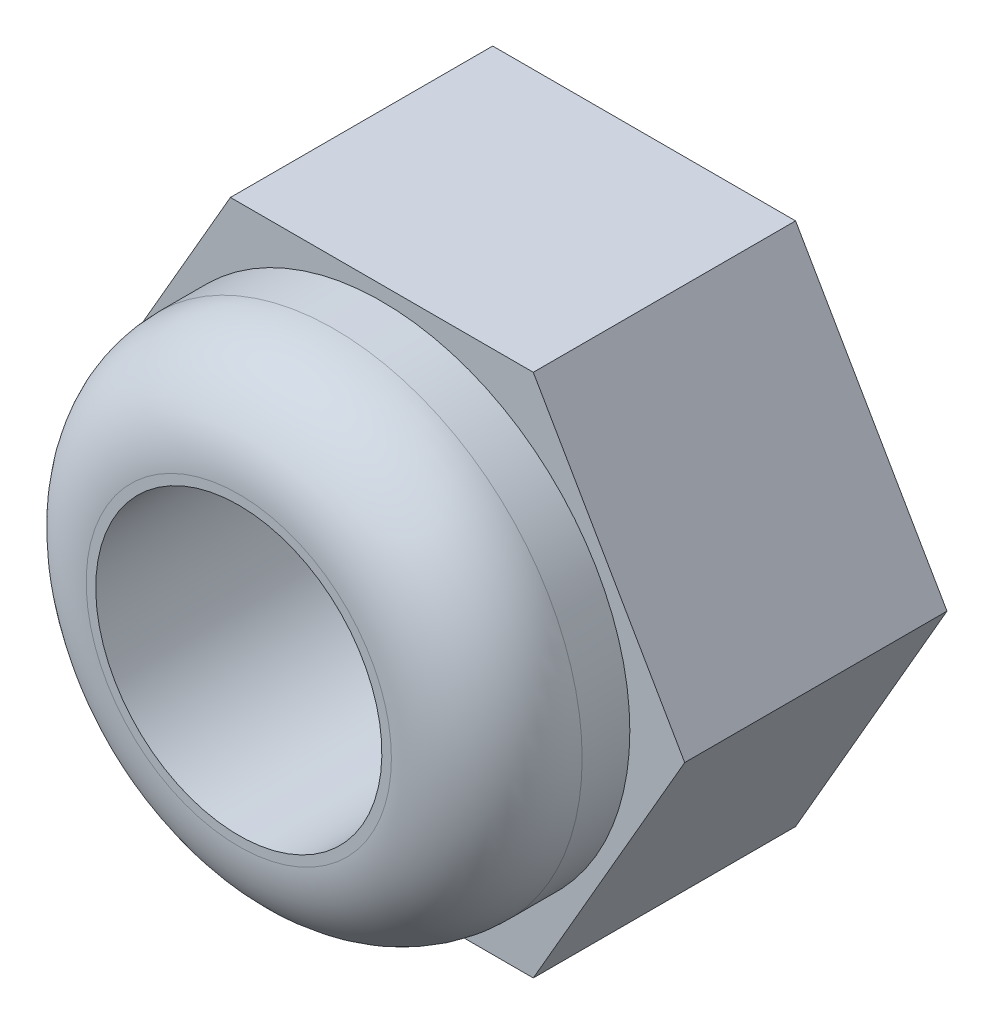
ISO-10303-21;
HEADER;
FILE_DESCRIPTION(('STEP AP214'),'2;1');
FILE_NAME('part.step','',(''),(''),'','','');
FILE_SCHEMA(('AUTOMOTIVE_DESIGN { 1 0 10303 214 1 1 1 1 }'));
ENDSEC;
DATA;
#1=APPLICATION_CONTEXT('core data for automotive mechanical design processes');
#2=APPLICATION_PROTOCOL_DEFINITION('international standard','automotive_design',2000,#1);
#3=PRODUCT_CONTEXT('',#1,'mechanical');
#4=PRODUCT('Part','Part','',(#3));
#5=PRODUCT_RELATED_PRODUCT_CATEGORY('part','',(#4));
#6=PRODUCT_DEFINITION_FORMATION('','',#4);
#7=PRODUCT_DEFINITION_CONTEXT('part definition',#1,'design');
#8=PRODUCT_DEFINITION('design','',#6,#7);
#9=PRODUCT_DEFINITION_SHAPE('','',#8);
#10=(LENGTH_UNIT() NAMED_UNIT(*) SI_UNIT(.MILLI.,.METRE.));
#11=(NAMED_UNIT(*) PLANE_ANGLE_UNIT() SI_UNIT($,.RADIAN.));
#12=(NAMED_UNIT(*) SI_UNIT($,.STERADIAN.) SOLID_ANGLE_UNIT());
#13=UNCERTAINTY_MEASURE_WITH_UNIT(LENGTH_MEASURE(1.E-05),#10,'distance_accuracy_value','');
#14=(GEOMETRIC_REPRESENTATION_CONTEXT(3) GLOBAL_UNCERTAINTY_ASSIGNED_CONTEXT((#13)) GLOBAL_UNIT_ASSIGNED_CONTEXT((#10,
#11,#12)) REPRESENTATION_CONTEXT('',''));
#15=CARTESIAN_POINT('',(0.,0.,0.));
#16=DIRECTION('',(0.,0.,1.));
#17=DIRECTION('',(1.,0.,0.));
#18=AXIS2_PLACEMENT_3D('',#15,#16,#17);
#19=CARTESIAN_POINT('',(-1.58771324027147,-2.75,0.));
#20=DIRECTION('',(0.,-1.,0.));
#21=DIRECTION('',(1.,0.,0.));
#22=AXIS2_PLACEMENT_3D('',#19,#20,#21);
#23=PLANE('',#22);
#24=DIRECTION('',(1.,0.,0.));
#25=VECTOR('',#24,1.);
#26=CARTESIAN_POINT('',(-1.58771324027147,-2.75,2.75));
#27=LINE('',#26,#25);
#28=CARTESIAN_POINT('',(-1.58771324027147,-2.75,2.75));
#29=VERTEX_POINT('',#28);
#30=CARTESIAN_POINT('',(1.58771324027147,-2.75,2.75));
#31=VERTEX_POINT('',#30);
#32=EDGE_CURVE('E132',#29,#31,#27,.T.);
#33=ORIENTED_EDGE('',*,*,#32,.F.);
#34=DIRECTION('',(0.,0.,1.));
#35=VECTOR('',#34,1.);
#36=CARTESIAN_POINT('',(-1.58771324027147,-2.75,0.));
#37=LINE('',#36,#35);
#38=CARTESIAN_POINT('',(-1.58771324027147,-2.75,0.));
#39=VERTEX_POINT('',#38);
#40=EDGE_CURVE('E54',#39,#29,#37,.T.);
#41=ORIENTED_EDGE('',*,*,#40,.F.);
#42=DIRECTION('',(1.,0.,0.));
#43=VECTOR('',#42,1.);
#44=CARTESIAN_POINT('',(-1.58771324027147,-2.75,0.));
#45=LINE('',#44,#43);
#46=CARTESIAN_POINT('',(1.58771324027147,-2.75,0.));
#47=VERTEX_POINT('',#46);
#48=EDGE_CURVE('E153',#39,#47,#45,.T.);
#49=ORIENTED_EDGE('',*,*,#48,.T.);
#50=DIRECTION('',(0.,0.,1.));
#51=VECTOR('',#50,1.);
#52=CARTESIAN_POINT('',(1.58771324027147,-2.75,0.));
#53=LINE('',#52,#51);
#54=EDGE_CURVE('E89',#47,#31,#53,.T.);
#55=ORIENTED_EDGE('',*,*,#54,.T.);
#56=EDGE_LOOP('',(#33,#41,#49,#55));
#57=FACE_BOUND('',#56,.T.);
#58=ADVANCED_FACE('F36',(#57),#23,.T.);
#59=CARTESIAN_POINT('',(-3.17542648054294,0.,0.));
#60=DIRECTION('',(-0.866025403784438,-0.500000000000001,0.));
#61=DIRECTION('',(0.500000000000001,-0.866025403784438,0.));
#62=AXIS2_PLACEMENT_3D('',#59,#60,#61);
#63=PLANE('',#62);
#64=DIRECTION('',(0.500000000000001,-0.866025403784438,0.));
#65=VECTOR('',#64,1.);
#66=CARTESIAN_POINT('',(-3.17542648054294,0.,2.75));
#67=LINE('',#66,#65);
#68=CARTESIAN_POINT('',(-3.17542648054294,0.,2.75));
#69=VERTEX_POINT('',#68);
#70=EDGE_CURVE('E149',#69,#29,#67,.T.);
#71=ORIENTED_EDGE('',*,*,#70,.F.);
#72=DIRECTION('',(0.,0.,1.));
#73=VECTOR('',#72,1.);
#74=CARTESIAN_POINT('',(-3.17542648054294,0.,0.));
#75=LINE('',#74,#73);
#76=CARTESIAN_POINT('',(-3.17542648054294,0.,0.));
#77=VERTEX_POINT('',#76);
#78=EDGE_CURVE('E77',#77,#69,#75,.T.);
#79=ORIENTED_EDGE('',*,*,#78,.F.);
#80=DIRECTION('',(0.500000000000001,-0.866025403784438,0.));
#81=VECTOR('',#80,1.);
#82=CARTESIAN_POINT('',(-3.17542648054294,0.,0.));
#83=LINE('',#82,#81);
#84=EDGE_CURVE('E116',#77,#39,#83,.T.);
#85=ORIENTED_EDGE('',*,*,#84,.T.);
#86=ORIENTED_EDGE('',*,*,#40,.T.);
#87=EDGE_LOOP('',(#71,#79,#85,#86));
#88=FACE_BOUND('',#87,.T.);
#89=ADVANCED_FACE('F185',(#88),#63,.T.);
#90=CARTESIAN_POINT('',(-1.58771324027147,2.75,0.));
#91=DIRECTION('',(-0.866025403784439,0.499999999999999,0.));
#92=DIRECTION('',(-0.499999999999999,-0.866025403784439,0.));
#93=AXIS2_PLACEMENT_3D('',#90,#91,#92);
#94=PLANE('',#93);
#95=DIRECTION('',(-0.499999999999999,-0.866025403784439,0.));
#96=VECTOR('',#95,1.);
#97=CARTESIAN_POINT('',(-1.58771324027147,2.75,2.75));
#98=LINE('',#97,#96);
#99=CARTESIAN_POINT('',(-1.58771324027147,2.75,2.75));
#100=VERTEX_POINT('',#99);
#101=EDGE_CURVE('E102',#100,#69,#98,.T.);
#102=ORIENTED_EDGE('',*,*,#101,.F.);
#103=DIRECTION('',(0.,0.,1.));
#104=VECTOR('',#103,1.);
#105=CARTESIAN_POINT('',(-1.58771324027147,2.75,0.));
#106=LINE('',#105,#104);
#107=CARTESIAN_POINT('',(-1.58771324027147,2.75,0.));
#108=VERTEX_POINT('',#107);
#109=EDGE_CURVE('E97',#108,#100,#106,.T.);
#110=ORIENTED_EDGE('',*,*,#109,.F.);
#111=DIRECTION('',(-0.499999999999999,-0.866025403784439,0.));
#112=VECTOR('',#111,1.);
#113=CARTESIAN_POINT('',(-1.58771324027147,2.75,0.));
#114=LINE('',#113,#112);
#115=EDGE_CURVE('E100',#108,#77,#114,.T.);
#116=ORIENTED_EDGE('',*,*,#115,.T.);
#117=ORIENTED_EDGE('',*,*,#78,.T.);
#118=EDGE_LOOP('',(#102,#110,#116,#117));
#119=FACE_BOUND('',#118,.T.);
#120=ADVANCED_FACE('F99',(#119),#94,.T.);
#121=CARTESIAN_POINT('',(1.58771324027147,2.75,0.));
#122=DIRECTION('',(0.,1.,0.));
#123=DIRECTION('',(-1.,0.,0.));
#124=AXIS2_PLACEMENT_3D('',#121,#122,#123);
#125=PLANE('',#124);
#126=DIRECTION('',(-1.,0.,0.));
#127=VECTOR('',#126,1.);
#128=CARTESIAN_POINT('',(1.58771324027147,2.75,2.75));
#129=LINE('',#128,#127);
#130=CARTESIAN_POINT('',(1.58771324027147,2.75,2.75));
#131=VERTEX_POINT('',#130);
#132=EDGE_CURVE('E144',#131,#100,#129,.T.);
#133=ORIENTED_EDGE('',*,*,#132,.F.);
#134=DIRECTION('',(0.,0.,1.));
#135=VECTOR('',#134,1.);
#136=CARTESIAN_POINT('',(1.58771324027147,2.75,0.));
#137=LINE('',#136,#135);
#138=CARTESIAN_POINT('',(1.58771324027147,2.75,0.));
#139=VERTEX_POINT('',#138);
#140=EDGE_CURVE('E108',#139,#131,#137,.T.);
#141=ORIENTED_EDGE('',*,*,#140,.F.);
#142=DIRECTION('',(-1.,0.,0.));
#143=VECTOR('',#142,1.);
#144=CARTESIAN_POINT('',(1.58771324027147,2.75,0.));
#145=LINE('',#144,#143);
#146=EDGE_CURVE('E114',#139,#108,#145,.T.);
#147=ORIENTED_EDGE('',*,*,#146,.T.);
#148=ORIENTED_EDGE('',*,*,#109,.T.);
#149=EDGE_LOOP('',(#133,#141,#147,#148));
#150=FACE_BOUND('',#149,.T.);
#151=ADVANCED_FACE('F119',(#150),#125,.T.);
#152=CARTESIAN_POINT('',(3.17542648054294,0.,0.));
#153=DIRECTION('',(0.866025403784438,0.500000000000001,0.));
#154=DIRECTION('',(-0.500000000000001,0.866025403784438,0.));
#155=AXIS2_PLACEMENT_3D('',#152,#153,#154);
#156=PLANE('',#155);
#157=DIRECTION('',(-0.500000000000001,0.866025403784438,0.));
#158=VECTOR('',#157,1.);
#159=CARTESIAN_POINT('',(3.17542648054294,0.,2.75));
#160=LINE('',#159,#158);
#161=CARTESIAN_POINT('',(3.17542648054294,0.,2.75));
#162=VERTEX_POINT('',#161);
#163=EDGE_CURVE('E141',#162,#131,#160,.T.);
#164=ORIENTED_EDGE('',*,*,#163,.F.);
#165=DIRECTION('',(0.,0.,1.));
#166=VECTOR('',#165,1.);
#167=CARTESIAN_POINT('',(3.17542648054294,0.,0.));
#168=LINE('',#167,#166);
#169=CARTESIAN_POINT('',(3.17542648054294,0.,0.));
#170=VERTEX_POINT('',#169);
#171=EDGE_CURVE('E160',#170,#162,#168,.T.);
#172=ORIENTED_EDGE('',*,*,#171,.F.);
#173=DIRECTION('',(-0.500000000000001,0.866025403784438,0.));
#174=VECTOR('',#173,1.);
#175=CARTESIAN_POINT('',(3.17542648054294,0.,0.));
#176=LINE('',#175,#174);
#177=EDGE_CURVE('E121',#170,#139,#176,.T.);
#178=ORIENTED_EDGE('',*,*,#177,.T.);
#179=ORIENTED_EDGE('',*,*,#140,.T.);
#180=EDGE_LOOP('',(#164,#172,#178,#179));
#181=FACE_BOUND('',#180,.T.);
#182=ADVANCED_FACE('F194',(#181),#156,.T.);
#183=CARTESIAN_POINT('',(1.58771324027147,-2.75,0.));
#184=DIRECTION('',(0.866025403784439,-0.5,0.));
#185=DIRECTION('',(0.5,0.866025403784439,0.));
#186=AXIS2_PLACEMENT_3D('',#183,#184,#185);
#187=PLANE('',#186);
#188=DIRECTION('',(0.5,0.866025403784439,0.));
#189=VECTOR('',#188,1.);
#190=CARTESIAN_POINT('',(1.58771324027147,-2.75,2.75));
#191=LINE('',#190,#189);
#192=EDGE_CURVE('E136',#31,#162,#191,.T.);
#193=ORIENTED_EDGE('',*,*,#192,.F.);
#194=ORIENTED_EDGE('',*,*,#54,.F.);
#195=DIRECTION('',(0.5,0.866025403784439,0.));
#196=VECTOR('',#195,1.);
#197=CARTESIAN_POINT('',(1.58771324027147,-2.75,0.));
#198=LINE('',#197,#196);
#199=EDGE_CURVE('E126',#47,#170,#198,.T.);
#200=ORIENTED_EDGE('',*,*,#199,.T.);
#201=ORIENTED_EDGE('',*,*,#171,.T.);
#202=EDGE_LOOP('',(#193,#194,#200,#201));
#203=FACE_BOUND('',#202,.T.);
#204=ADVANCED_FACE('F191',(#203),#187,.T.);
#205=CARTESIAN_POINT('',(0.,0.,0.));
#206=DIRECTION('',(0.,0.,1.));
#207=DIRECTION('',(1.,0.,0.));
#208=AXIS2_PLACEMENT_3D('',#205,#206,#207);
#209=PLANE('',#208);
#210=CARTESIAN_POINT('',(0.,0.,0.));
#211=DIRECTION('',(0.,0.,-1.));
#212=DIRECTION('',(0.,1.,0.));
#213=AXIS2_PLACEMENT_3D('',#210,#211,#212);
#214=CIRCLE('',#213,1.49999999999998);
#215=CARTESIAN_POINT('',(0.,1.49999999999999,0.));
#216=VERTEX_POINT('',#215);
#217=EDGE_CURVE('E305',#216,#216,#214,.T.);
#218=ORIENTED_EDGE('',*,*,#217,.F.);
#219=EDGE_LOOP('',(#218));
#220=FACE_BOUND('',#219,.T.);
#221=ORIENTED_EDGE('',*,*,#48,.F.);
#222=ORIENTED_EDGE('',*,*,#84,.F.);
#223=ORIENTED_EDGE('',*,*,#115,.F.);
#224=ORIENTED_EDGE('',*,*,#146,.F.);
#225=ORIENTED_EDGE('',*,*,#177,.F.);
#226=ORIENTED_EDGE('',*,*,#199,.F.);
#227=EDGE_LOOP('',(#221,#222,#223,#224,#225,#226));
#228=FACE_BOUND('',#227,.T.);
#229=ADVANCED_FACE('F112',(#220,#228),#209,.F.);
#230=CARTESIAN_POINT('',(0.,0.,2.75));
#231=DIRECTION('',(0.,0.,1.));
#232=DIRECTION('',(1.,0.,0.));
#233=AXIS2_PLACEMENT_3D('',#230,#231,#232);
#234=PLANE('',#233);
#235=CARTESIAN_POINT('',(0.,0.,2.75));
#236=DIRECTION('',(0.,0.,1.));
#237=DIRECTION('',(1.,0.,0.));
#238=AXIS2_PLACEMENT_3D('',#235,#236,#237);
#239=CIRCLE('',#238,2.6);
#240=CARTESIAN_POINT('',(2.6,0.,2.75));
#241=VERTEX_POINT('',#240);
#242=EDGE_CURVE('E156',#241,#241,#239,.T.);
#243=ORIENTED_EDGE('',*,*,#242,.F.);
#244=EDGE_LOOP('',(#243));
#245=FACE_BOUND('',#244,.T.);
#246=ORIENTED_EDGE('',*,*,#32,.T.);
#247=ORIENTED_EDGE('',*,*,#192,.T.);
#248=ORIENTED_EDGE('',*,*,#163,.T.);
#249=ORIENTED_EDGE('',*,*,#132,.T.);
#250=ORIENTED_EDGE('',*,*,#101,.T.);
#251=ORIENTED_EDGE('',*,*,#70,.T.);
#252=EDGE_LOOP('',(#246,#247,#248,#249,#250,#251));
#253=FACE_BOUND('',#252,.T.);
#254=ADVANCED_FACE('F202',(#245,#253),#234,.T.);
#255=CARTESIAN_POINT('',(0.,0.,2.75));
#256=DIRECTION('',(0.,0.,1.));
#257=DIRECTION('',(1.,0.,0.));
#258=AXIS2_PLACEMENT_3D('',#255,#256,#257);
#259=CYLINDRICAL_SURFACE('',#258,2.6);
#260=CARTESIAN_POINT('',(0.,0.,3.25));
#261=DIRECTION('',(0.,0.,1.));
#262=DIRECTION('',(1.,0.,0.));
#263=AXIS2_PLACEMENT_3D('',#260,#261,#262);
#264=CIRCLE('',#263,2.6);
#265=CARTESIAN_POINT('',(2.6,0.,3.25));
#266=VERTEX_POINT('',#265);
#267=EDGE_CURVE('E11',#266,#266,#264,.F.);
#268=ORIENTED_EDGE('',*,*,#267,.T.);
#269=EDGE_LOOP('',(#268));
#270=FACE_BOUND('',#269,.T.);
#271=ORIENTED_EDGE('',*,*,#242,.T.);
#272=EDGE_LOOP('',(#271));
#273=FACE_BOUND('',#272,.T.);
#274=ADVANCED_FACE('F205',(#270,#273),#259,.T.);
#275=CARTESIAN_POINT('',(0.,0.,4.25));
#276=DIRECTION('',(0.,0.,1.));
#277=DIRECTION('',(1.,0.,0.));
#278=AXIS2_PLACEMENT_3D('',#275,#276,#277);
#279=PLANE('',#278);
#280=CARTESIAN_POINT('',(0.,0.,4.25));
#281=DIRECTION('',(0.,0.,1.));
#282=DIRECTION('',(1.,0.,0.));
#283=AXIS2_PLACEMENT_3D('',#280,#281,#282);
#284=CIRCLE('',#283,1.6);
#285=CARTESIAN_POINT('',(1.6,0.,4.25));
#286=VERTEX_POINT('',#285);
#287=EDGE_CURVE('E46',#286,#286,#284,.T.);
#288=ORIENTED_EDGE('',*,*,#287,.T.);
#289=EDGE_LOOP('',(#288));
#290=FACE_BOUND('',#289,.T.);
#291=CARTESIAN_POINT('',(0.,0.,4.25));
#292=DIRECTION('',(0.,0.,-1.));
#293=DIRECTION('',(0.,1.,0.));
#294=AXIS2_PLACEMENT_3D('',#291,#292,#293);
#295=CIRCLE('',#294,1.49999999999998);
#296=CARTESIAN_POINT('',(0.,1.49999999999999,4.25));
#297=VERTEX_POINT('',#296);
#298=EDGE_CURVE('E137',#297,#297,#295,.T.);
#299=ORIENTED_EDGE('',*,*,#298,.T.);
#300=EDGE_LOOP('',(#299));
#301=FACE_BOUND('',#300,.T.);
#302=ADVANCED_FACE('F172',(#290,#301),#279,.T.);
#303=CARTESIAN_POINT('',(0.,0.,0.));
#304=DIRECTION('',(0.,0.,-1.));
#305=DIRECTION('',(0.,1.,0.));
#306=AXIS2_PLACEMENT_3D('',#303,#304,#305);
#307=CYLINDRICAL_SURFACE('',#306,1.49999999999998);
#308=ORIENTED_EDGE('',*,*,#298,.F.);
#309=EDGE_LOOP('',(#308));
#310=FACE_BOUND('',#309,.T.);
#311=ORIENTED_EDGE('',*,*,#217,.T.);
#312=EDGE_LOOP('',(#311));
#313=FACE_BOUND('',#312,.T.);
#314=ADVANCED_FACE('F176',(#310,#313),#307,.F.);
#315=CARTESIAN_POINT('',(0.,0.,3.25));
#316=DIRECTION('',(0.,0.,1.));
#317=DIRECTION('',(1.,0.,0.));
#318=AXIS2_PLACEMENT_3D('',#315,#316,#317);
#319=TOROIDAL_SURFACE('',#318,1.6,1.);
#320=ORIENTED_EDGE('',*,*,#267,.F.);
#321=EDGE_LOOP('',(#320));
#322=FACE_BOUND('',#321,.T.);
#323=ORIENTED_EDGE('',*,*,#287,.F.);
#324=EDGE_LOOP('',(#323));
#325=FACE_BOUND('',#324,.T.);
#326=ADVANCED_FACE('F38',(#322,#325),#319,.T.);
#327=CLOSED_SHELL('',(#58,#89,#120,#151,#182,#204,#229,#254,#274,#302,#314,#326));
#328=MANIFOLD_SOLID_BREP('B2',#327);
#329=ADVANCED_BREP_SHAPE_REPRESENTATION('',(#18,#328),#14);
#330=SHAPE_DEFINITION_REPRESENTATION(#9,#329);
ENDSEC;
END-ISO-10303-21;
